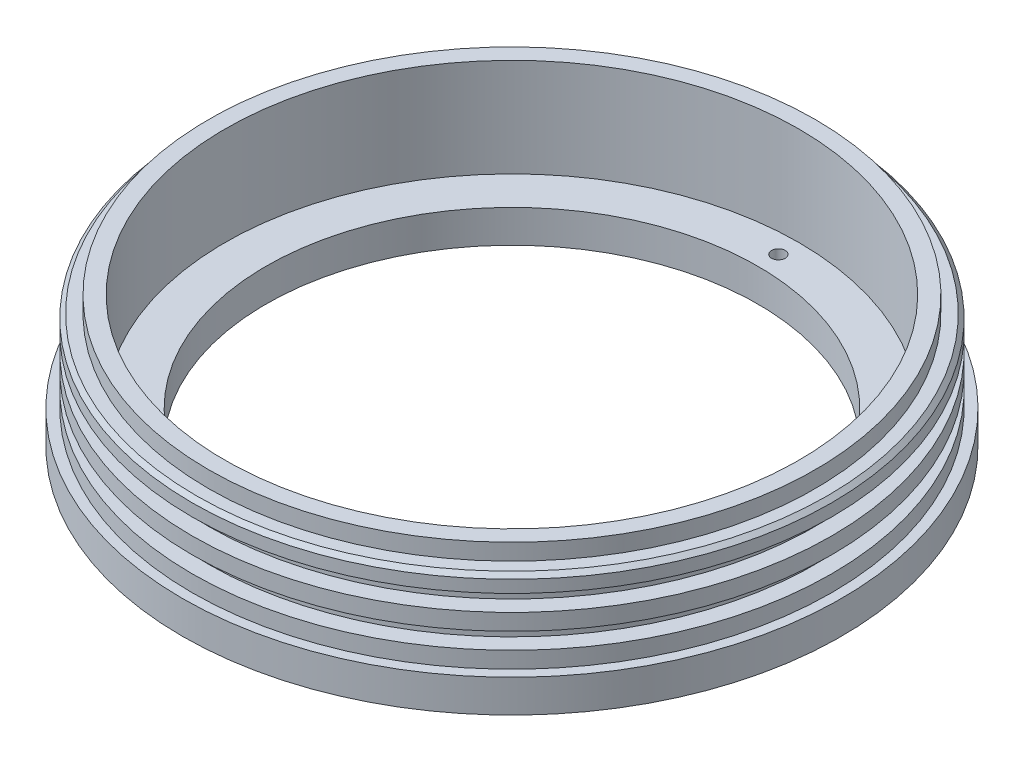
ISO-10303-21;
HEADER;
FILE_DESCRIPTION(('STEP AP214'),'2;1');
FILE_NAME('part.step','',(''),(''),'','','');
FILE_SCHEMA(('AUTOMOTIVE_DESIGN { 1 0 10303 214 1 1 1 1 }'));
ENDSEC;
DATA;
#1=APPLICATION_CONTEXT('core data for automotive mechanical design processes');
#2=APPLICATION_PROTOCOL_DEFINITION('international standard','automotive_design',2000,#1);
#3=PRODUCT_CONTEXT('',#1,'mechanical');
#4=PRODUCT('Part','Part','',(#3));
#5=PRODUCT_RELATED_PRODUCT_CATEGORY('part','',(#4));
#6=PRODUCT_DEFINITION_FORMATION('','',#4);
#7=PRODUCT_DEFINITION_CONTEXT('part definition',#1,'design');
#8=PRODUCT_DEFINITION('design','',#6,#7);
#9=PRODUCT_DEFINITION_SHAPE('','',#8);
#10=(LENGTH_UNIT() NAMED_UNIT(*) SI_UNIT(.MILLI.,.METRE.));
#11=(NAMED_UNIT(*) PLANE_ANGLE_UNIT() SI_UNIT($,.RADIAN.));
#12=(NAMED_UNIT(*) SI_UNIT($,.STERADIAN.) SOLID_ANGLE_UNIT());
#13=UNCERTAINTY_MEASURE_WITH_UNIT(LENGTH_MEASURE(1.E-05),#10,'distance_accuracy_value','');
#14=(GEOMETRIC_REPRESENTATION_CONTEXT(3) GLOBAL_UNCERTAINTY_ASSIGNED_CONTEXT((#13)) GLOBAL_UNIT_ASSIGNED_CONTEXT((#10,
#11,#12)) REPRESENTATION_CONTEXT('',''));
#15=CARTESIAN_POINT('',(0.,0.,0.));
#16=DIRECTION('',(0.,0.,1.));
#17=DIRECTION('',(1.,0.,0.));
#18=AXIS2_PLACEMENT_3D('',#15,#16,#17);
#19=CARTESIAN_POINT('',(0.,20.32,0.));
#20=DIRECTION('',(0.,1.,0.));
#21=DIRECTION('',(0.,0.,1.));
#22=AXIS2_PLACEMENT_3D('',#19,#20,#21);
#23=PLANE('',#22);
#24=CARTESIAN_POINT('',(0.,20.32,0.));
#25=DIRECTION('',(0.,1.,0.));
#26=DIRECTION('',(0.,0.,1.));
#27=AXIS2_PLACEMENT_3D('',#24,#25,#26);
#28=CIRCLE('',#27,44.45);
#29=CARTESIAN_POINT('',(0.,20.32,-44.45));
#30=VERTEX_POINT('',#29);
#31=EDGE_CURVE('E77',#30,#30,#28,.T.);
#32=ORIENTED_EDGE('',*,*,#31,.F.);
#33=EDGE_LOOP('',(#32));
#34=FACE_BOUND('',#33,.T.);
#35=CARTESIAN_POINT('',(0.,20.32,0.));
#36=DIRECTION('',(0.,-1.,0.));
#37=DIRECTION('',(0.,0.,-1.));
#38=AXIS2_PLACEMENT_3D('',#35,#36,#37);
#39=CIRCLE('',#38,46.99);
#40=CARTESIAN_POINT('',(0.,20.32,-46.99));
#41=VERTEX_POINT('',#40);
#42=EDGE_CURVE('E97',#41,#41,#39,.T.);
#43=ORIENTED_EDGE('',*,*,#42,.F.);
#44=EDGE_LOOP('',(#43));
#45=FACE_BOUND('',#44,.T.);
#46=ADVANCED_FACE('F46',(#34,#45),#23,.T.);
#47=CARTESIAN_POINT('',(0.,20.32,0.));
#48=DIRECTION('',(0.,-1.,0.));
#49=DIRECTION('',(0.,0.,-1.));
#50=AXIS2_PLACEMENT_3D('',#47,#48,#49);
#51=CYLINDRICAL_SURFACE('',#50,49.53);
#52=CARTESIAN_POINT('',(0.,5.08,0.));
#53=DIRECTION('',(0.,1.,0.));
#54=DIRECTION('',(0.,0.,1.));
#55=AXIS2_PLACEMENT_3D('',#52,#53,#54);
#56=CIRCLE('',#55,49.53);
#57=CARTESIAN_POINT('',(0.,5.08,-49.53));
#58=VERTEX_POINT('',#57);
#59=EDGE_CURVE('E61',#58,#58,#56,.T.);
#60=CARTESIAN_POINT('',(0.,7.62000000000001,0.));
#61=DIRECTION('',(0.,-1.,0.));
#62=DIRECTION('',(0.,0.,-1.));
#63=AXIS2_PLACEMENT_3D('',#60,#61,#62);
#64=CIRCLE('',#63,49.53);
#65=CARTESIAN_POINT('',(0.,7.62000000000001,-49.53));
#66=VERTEX_POINT('',#65);
#67=EDGE_CURVE('E120',#66,#66,#64,.T.);
#68=CARTESIAN_POINT('',(0.,5.08,-49.53));
#69=CARTESIAN_POINT('',(0.,5.10645833333333,-49.53));
#70=CARTESIAN_POINT('',(0.,5.13291666666667,-49.53));
#71=CARTESIAN_POINT('',(0.,5.18583333333333,-49.53));
#72=CARTESIAN_POINT('',(0.,5.21229166666667,-49.53));
#73=CARTESIAN_POINT('',(0.,5.26520833333333,-49.53));
#74=CARTESIAN_POINT('',(0.,5.29166666666667,-49.53));
#75=CARTESIAN_POINT('',(0.,5.34458333333333,-49.53));
#76=CARTESIAN_POINT('',(0.,5.37104166666667,-49.53));
#77=CARTESIAN_POINT('',(0.,5.42395833333333,-49.53));
#78=CARTESIAN_POINT('',(0.,5.45041666666667,-49.53));
#79=CARTESIAN_POINT('',(0.,5.50333333333333,-49.53));
#80=CARTESIAN_POINT('',(0.,5.52979166666667,-49.53));
#81=CARTESIAN_POINT('',(0.,5.58270833333334,-49.53));
#82=CARTESIAN_POINT('',(0.,5.60916666666667,-49.53));
#83=CARTESIAN_POINT('',(0.,5.66208333333334,-49.53));
#84=CARTESIAN_POINT('',(0.,5.68854166666667,-49.53));
#85=CARTESIAN_POINT('',(0.,5.74145833333334,-49.53));
#86=CARTESIAN_POINT('',(0.,5.76791666666667,-49.53));
#87=CARTESIAN_POINT('',(0.,5.82083333333334,-49.53));
#88=CARTESIAN_POINT('',(0.,5.84729166666667,-49.53));
#89=CARTESIAN_POINT('',(0.,5.90020833333334,-49.53));
#90=CARTESIAN_POINT('',(0.,5.92666666666667,-49.53));
#91=CARTESIAN_POINT('',(0.,5.97958333333334,-49.53));
#92=CARTESIAN_POINT('',(0.,6.00604166666667,-49.53));
#93=CARTESIAN_POINT('',(0.,6.05895833333334,-49.53));
#94=CARTESIAN_POINT('',(0.,6.08541666666667,-49.53));
#95=CARTESIAN_POINT('',(0.,6.13833333333334,-49.53));
#96=CARTESIAN_POINT('',(0.,6.16479166666667,-49.53));
#97=CARTESIAN_POINT('',(0.,6.21770833333334,-49.53));
#98=CARTESIAN_POINT('',(0.,6.24416666666667,-49.53));
#99=CARTESIAN_POINT('',(0.,6.29708333333334,-49.53));
#100=CARTESIAN_POINT('',(0.,6.32354166666667,-49.53));
#101=CARTESIAN_POINT('',(0.,6.37645833333334,-49.53));
#102=CARTESIAN_POINT('',(0.,6.40291666666667,-49.53));
#103=CARTESIAN_POINT('',(0.,6.45583333333334,-49.53));
#104=CARTESIAN_POINT('',(0.,6.48229166666667,-49.53));
#105=CARTESIAN_POINT('',(0.,6.53520833333334,-49.53));
#106=CARTESIAN_POINT('',(0.,6.56166666666667,-49.53));
#107=CARTESIAN_POINT('',(0.,6.61458333333334,-49.53));
#108=CARTESIAN_POINT('',(0.,6.64104166666667,-49.53));
#109=CARTESIAN_POINT('',(0.,6.69395833333334,-49.53));
#110=CARTESIAN_POINT('',(0.,6.72041666666667,-49.53));
#111=CARTESIAN_POINT('',(0.,6.77333333333334,-49.53));
#112=CARTESIAN_POINT('',(0.,6.79979166666667,-49.53));
#113=CARTESIAN_POINT('',(0.,6.85270833333334,-49.53));
#114=CARTESIAN_POINT('',(0.,6.87916666666667,-49.53));
#115=CARTESIAN_POINT('',(0.,6.93208333333334,-49.53));
#116=CARTESIAN_POINT('',(0.,6.95854166666667,-49.53));
#117=CARTESIAN_POINT('',(0.,7.01145833333334,-49.53));
#118=CARTESIAN_POINT('',(0.,7.03791666666667,-49.53));
#119=CARTESIAN_POINT('',(0.,7.09083333333334,-49.53));
#120=CARTESIAN_POINT('',(0.,7.11729166666668,-49.53));
#121=CARTESIAN_POINT('',(0.,7.17020833333334,-49.53));
#122=CARTESIAN_POINT('',(0.,7.19666666666668,-49.53));
#123=CARTESIAN_POINT('',(0.,7.24958333333334,-49.53));
#124=CARTESIAN_POINT('',(0.,7.27604166666668,-49.53));
#125=CARTESIAN_POINT('',(0.,7.32895833333334,-49.53));
#126=CARTESIAN_POINT('',(0.,7.35541666666668,-49.53));
#127=CARTESIAN_POINT('',(0.,7.40833333333334,-49.53));
#128=CARTESIAN_POINT('',(0.,7.43479166666668,-49.53));
#129=CARTESIAN_POINT('',(0.,7.48770833333334,-49.53));
#130=CARTESIAN_POINT('',(0.,7.51416666666668,-49.53));
#131=CARTESIAN_POINT('',(0.,7.56708333333334,-49.53));
#132=CARTESIAN_POINT('',(0.,7.59354166666668,-49.53));
#133=CARTESIAN_POINT('',(0.,7.62000000000001,-49.53));
#134=B_SPLINE_CURVE_WITH_KNOTS('',3,(#68,#69,#70,#71,#72,#73,#74,#75,#76,#77,#78,#79,#80,#81,
#82,#83,#84,#85,#86,#87,#88,#89,#90,#91,#92,#93,#94,#95,#96,#97,#98,#99,#100,#101,#102,#103,
#104,#105,#106,#107,#108,#109,#110,#111,#112,#113,#114,#115,#116,#117,#118,#119,#120,#121,#122,
#123,#124,#125,#126,#127,#128,#129,#130,#131,#132,#133),.UNSPECIFIED.,.F.,.F.,(4,2,2,2,2,2,2,2,
2,2,2,2,2,2,2,2,2,2,2,2,2,2,2,2,2,2,2,2,2,2,2,2,4),(0.,0.0793749999999996,0.158750000000001,
0.238125,0.317500000000002,0.396875000000001,0.476250000000003,0.555625000000002,
0.635000000000004,0.714375000000003,0.793750000000003,0.873125000000004,0.952500000000004,
1.031875,1.11125,1.190625,1.27000000000001,1.34937500000001,1.42875000000001,1.50812500000001,
1.58750000000001,1.66687500000001,1.74625000000001,1.82562500000001,1.90500000000001,
1.98437500000001,2.06375000000001,2.14312500000001,2.22250000000001,2.30187500000001,
2.38125000000001,2.46062500000001,2.54000000000001),.UNSPECIFIED.);
#135=EDGE_CURVE('BSEAM154',#58,#66,#134,.T.);
#136=ORIENTED_EDGE('',*,*,#59,.T.);
#137=ORIENTED_EDGE('',*,*,#67,.T.);
#138=ORIENTED_EDGE('',*,*,#135,.T.);
#139=ORIENTED_EDGE('',*,*,#135,.F.);
#140=EDGE_LOOP('',(#136,#138,#137,#139));
#141=FACE_BOUND('',#140,.T.);
#142=ADVANCED_FACE('F154',(#141),#51,.T.);
#143=CARTESIAN_POINT('',(0.,5.08,0.));
#144=DIRECTION('',(0.,1.,0.));
#145=DIRECTION('',(0.,0.,1.));
#146=AXIS2_PLACEMENT_3D('',#143,#144,#145);
#147=PLANE('',#146);
#148=CARTESIAN_POINT('',(0.,5.08,-41.275));
#149=DIRECTION('',(0.,1.,0.));
#150=DIRECTION('',(0.,0.,1.));
#151=AXIS2_PLACEMENT_3D('',#148,#149,#150);
#152=CIRCLE('',#151,1.058333164);
#153=CARTESIAN_POINT('',(0.,5.08,-40.216666836));
#154=VERTEX_POINT('',#153);
#155=EDGE_CURVE('E131',#154,#154,#152,.T.);
#156=ORIENTED_EDGE('',*,*,#155,.F.);
#157=EDGE_LOOP('',(#156));
#158=FACE_BOUND('',#157,.T.);
#159=CARTESIAN_POINT('',(0.,5.08,0.));
#160=DIRECTION('',(0.,1.,0.));
#161=DIRECTION('',(0.,0.,1.));
#162=AXIS2_PLACEMENT_3D('',#159,#160,#161);
#163=CIRCLE('',#162,38.1);
#164=CARTESIAN_POINT('',(0.,5.08,38.1));
#165=VERTEX_POINT('',#164);
#166=EDGE_CURVE('E69',#165,#165,#163,.T.);
#167=ORIENTED_EDGE('',*,*,#166,.F.);
#168=EDGE_LOOP('',(#167));
#169=FACE_BOUND('',#168,.T.);
#170=CARTESIAN_POINT('',(0.,5.08,0.));
#171=DIRECTION('',(0.,1.,0.));
#172=DIRECTION('',(0.,0.,1.));
#173=AXIS2_PLACEMENT_3D('',#170,#171,#172);
#174=CIRCLE('',#173,44.45);
#175=CARTESIAN_POINT('',(0.,5.08,-44.45));
#176=VERTEX_POINT('',#175);
#177=EDGE_CURVE('E84',#176,#176,#174,.T.);
#178=ORIENTED_EDGE('',*,*,#177,.T.);
#179=EDGE_LOOP('',(#178));
#180=FACE_BOUND('',#179,.T.);
#181=ADVANCED_FACE('F161',(#158,#169,#180),#147,.T.);
#182=ORIENTED_EDGE('',*,*,#59,.F.);
#183=EDGE_LOOP('',(#182));
#184=FACE_BOUND('',#183,.T.);
#185=CARTESIAN_POINT('',(0.,5.08,0.));
#186=DIRECTION('',(0.,1.,0.));
#187=DIRECTION('',(0.,0.,1.));
#188=AXIS2_PLACEMENT_3D('',#185,#186,#187);
#189=CIRCLE('',#188,51.054);
#190=CARTESIAN_POINT('',(0.,5.08,51.054));
#191=VERTEX_POINT('',#190);
#192=EDGE_CURVE('E68',#191,#191,#189,.T.);
#193=ORIENTED_EDGE('',*,*,#192,.T.);
#194=EDGE_LOOP('',(#193));
#195=FACE_BOUND('',#194,.T.);
#196=ADVANCED_FACE('F180',(#184,#195),#147,.T.);
#197=CARTESIAN_POINT('',(0.,0.,0.));
#198=DIRECTION('',(0.,1.,0.));
#199=DIRECTION('',(0.,0.,1.));
#200=AXIS2_PLACEMENT_3D('',#197,#198,#199);
#201=PLANE('',#200);
#202=CARTESIAN_POINT('',(0.,0.,-41.275));
#203=DIRECTION('',(0.,1.,0.));
#204=DIRECTION('',(0.,0.,1.));
#205=AXIS2_PLACEMENT_3D('',#202,#203,#204);
#206=CIRCLE('',#205,1.058333164);
#207=CARTESIAN_POINT('',(0.,0.,-40.216666836));
#208=VERTEX_POINT('',#207);
#209=EDGE_CURVE('E51',#208,#208,#206,.T.);
#210=ORIENTED_EDGE('',*,*,#209,.T.);
#211=EDGE_LOOP('',(#210));
#212=FACE_BOUND('',#211,.T.);
#213=CARTESIAN_POINT('',(0.,0.,0.));
#214=DIRECTION('',(0.,1.,0.));
#215=DIRECTION('',(0.,0.,1.));
#216=AXIS2_PLACEMENT_3D('',#213,#214,#215);
#217=CIRCLE('',#216,51.054);
#218=CARTESIAN_POINT('',(0.,0.,51.054));
#219=VERTEX_POINT('',#218);
#220=EDGE_CURVE('E64',#219,#219,#217,.T.);
#221=ORIENTED_EDGE('',*,*,#220,.F.);
#222=EDGE_LOOP('',(#221));
#223=FACE_BOUND('',#222,.T.);
#224=CARTESIAN_POINT('',(0.,0.,0.));
#225=DIRECTION('',(0.,1.,0.));
#226=DIRECTION('',(0.,0.,1.));
#227=AXIS2_PLACEMENT_3D('',#224,#225,#226);
#228=CIRCLE('',#227,38.1);
#229=CARTESIAN_POINT('',(0.,0.,38.1));
#230=VERTEX_POINT('',#229);
#231=EDGE_CURVE('E73',#230,#230,#228,.T.);
#232=ORIENTED_EDGE('',*,*,#231,.T.);
#233=EDGE_LOOP('',(#232));
#234=FACE_BOUND('',#233,.T.);
#235=ADVANCED_FACE('F140',(#212,#223,#234),#201,.F.);
#236=CARTESIAN_POINT('',(0.,5.08,0.));
#237=DIRECTION('',(0.,-1.,0.));
#238=DIRECTION('',(0.,0.,-1.));
#239=AXIS2_PLACEMENT_3D('',#236,#237,#238);
#240=CYLINDRICAL_SURFACE('',#239,51.054);
#241=ORIENTED_EDGE('',*,*,#192,.F.);
#242=EDGE_LOOP('',(#241));
#243=FACE_BOUND('',#242,.T.);
#244=ORIENTED_EDGE('',*,*,#220,.T.);
#245=EDGE_LOOP('',(#244));
#246=FACE_BOUND('',#245,.T.);
#247=ADVANCED_FACE('F178',(#243,#246),#240,.T.);
#248=CARTESIAN_POINT('',(0.,5.08,0.));
#249=DIRECTION('',(0.,-1.,0.));
#250=DIRECTION('',(0.,0.,-1.));
#251=AXIS2_PLACEMENT_3D('',#248,#249,#250);
#252=CYLINDRICAL_SURFACE('',#251,38.1);
#253=ORIENTED_EDGE('',*,*,#166,.T.);
#254=EDGE_LOOP('',(#253));
#255=FACE_BOUND('',#254,.T.);
#256=ORIENTED_EDGE('',*,*,#231,.F.);
#257=EDGE_LOOP('',(#256));
#258=FACE_BOUND('',#257,.T.);
#259=ADVANCED_FACE('F175',(#255,#258),#252,.F.);
#260=CARTESIAN_POINT('',(0.,20.32,0.));
#261=DIRECTION('',(0.,-1.,0.));
#262=DIRECTION('',(0.,0.,-1.));
#263=AXIS2_PLACEMENT_3D('',#260,#261,#262);
#264=CYLINDRICAL_SURFACE('',#263,44.45);
#265=CARTESIAN_POINT('',(0.,20.32,-44.45));
#266=CARTESIAN_POINT('',(0.,20.16125,-44.45));
#267=CARTESIAN_POINT('',(0.,20.0025,-44.45));
#268=CARTESIAN_POINT('',(0.,19.685,-44.45));
#269=CARTESIAN_POINT('',(0.,19.52625,-44.45));
#270=CARTESIAN_POINT('',(0.,19.20875,-44.45));
#271=CARTESIAN_POINT('',(0.,19.05,-44.45));
#272=CARTESIAN_POINT('',(0.,18.7325,-44.45));
#273=CARTESIAN_POINT('',(0.,18.57375,-44.45));
#274=CARTESIAN_POINT('',(0.,18.25625,-44.45));
#275=CARTESIAN_POINT('',(0.,18.0975,-44.45));
#276=CARTESIAN_POINT('',(0.,17.78,-44.45));
#277=CARTESIAN_POINT('',(0.,17.62125,-44.45));
#278=CARTESIAN_POINT('',(0.,17.30375,-44.45));
#279=CARTESIAN_POINT('',(0.,17.145,-44.45));
#280=CARTESIAN_POINT('',(0.,16.8275,-44.45));
#281=CARTESIAN_POINT('',(0.,16.66875,-44.45));
#282=CARTESIAN_POINT('',(0.,16.35125,-44.45));
#283=CARTESIAN_POINT('',(0.,16.1925,-44.45));
#284=CARTESIAN_POINT('',(0.,15.875,-44.45));
#285=CARTESIAN_POINT('',(0.,15.71625,-44.45));
#286=CARTESIAN_POINT('',(0.,15.39875,-44.45));
#287=CARTESIAN_POINT('',(0.,15.24,-44.45));
#288=CARTESIAN_POINT('',(0.,14.9225,-44.45));
#289=CARTESIAN_POINT('',(0.,14.76375,-44.45));
#290=CARTESIAN_POINT('',(0.,14.44625,-44.45));
#291=CARTESIAN_POINT('',(0.,14.2875,-44.45));
#292=CARTESIAN_POINT('',(0.,13.97,-44.45));
#293=CARTESIAN_POINT('',(0.,13.81125,-44.45));
#294=CARTESIAN_POINT('',(0.,13.49375,-44.45));
#295=CARTESIAN_POINT('',(0.,13.335,-44.45));
#296=CARTESIAN_POINT('',(0.,13.0175,-44.45));
#297=CARTESIAN_POINT('',(0.,12.85875,-44.45));
#298=CARTESIAN_POINT('',(0.,12.54125,-44.45));
#299=CARTESIAN_POINT('',(0.,12.3825,-44.45));
#300=CARTESIAN_POINT('',(0.,12.065,-44.45));
#301=CARTESIAN_POINT('',(0.,11.90625,-44.45));
#302=CARTESIAN_POINT('',(0.,11.58875,-44.45));
#303=CARTESIAN_POINT('',(0.,11.43,-44.45));
#304=CARTESIAN_POINT('',(0.,11.1125,-44.45));
#305=CARTESIAN_POINT('',(0.,10.95375,-44.45));
#306=CARTESIAN_POINT('',(0.,10.63625,-44.45));
#307=CARTESIAN_POINT('',(0.,10.4775,-44.45));
#308=CARTESIAN_POINT('',(0.,10.16,-44.45));
#309=CARTESIAN_POINT('',(0.,10.00125,-44.45));
#310=CARTESIAN_POINT('',(0.,9.68375,-44.45));
#311=CARTESIAN_POINT('',(0.,9.525,-44.45));
#312=CARTESIAN_POINT('',(0.,9.2075,-44.45));
#313=CARTESIAN_POINT('',(0.,9.04875,-44.45));
#314=CARTESIAN_POINT('',(0.,8.73125,-44.45));
#315=CARTESIAN_POINT('',(0.,8.5725,-44.45));
#316=CARTESIAN_POINT('',(0.,8.255,-44.45));
#317=CARTESIAN_POINT('',(0.,8.09625,-44.45));
#318=CARTESIAN_POINT('',(0.,7.77875,-44.45));
#319=CARTESIAN_POINT('',(0.,7.62,-44.45));
#320=CARTESIAN_POINT('',(0.,7.3025,-44.45));
#321=CARTESIAN_POINT('',(0.,7.14375,-44.45));
#322=CARTESIAN_POINT('',(0.,6.82625,-44.45));
#323=CARTESIAN_POINT('',(0.,6.6675,-44.45));
#324=CARTESIAN_POINT('',(0.,6.35,-44.45));
#325=CARTESIAN_POINT('',(0.,6.19125,-44.45));
#326=CARTESIAN_POINT('',(0.,5.87375,-44.45));
#327=CARTESIAN_POINT('',(0.,5.715,-44.45));
#328=CARTESIAN_POINT('',(0.,5.3975,-44.45));
#329=CARTESIAN_POINT('',(0.,5.23875,-44.45));
#330=CARTESIAN_POINT('',(0.,5.08,-44.45));
#331=B_SPLINE_CURVE_WITH_KNOTS('',3,(#265,#266,#267,#268,#269,#270,#271,#272,#273,#274,#275,
#276,#277,#278,#279,#280,#281,#282,#283,#284,#285,#286,#287,#288,#289,#290,#291,#292,#293,#294,
#295,#296,#297,#298,#299,#300,#301,#302,#303,#304,#305,#306,#307,#308,#309,#310,#311,#312,#313,
#314,#315,#316,#317,#318,#319,#320,#321,#322,#323,#324,#325,#326,#327,#328,#329,#330),
.UNSPECIFIED.,.F.,.F.,(4,2,2,2,2,2,2,2,2,2,2,2,2,2,2,2,2,2,2,2,2,2,2,2,2,2,2,2,2,2,2,2,4),(0.,
0.476249999999998,0.952499999999998,1.42875,1.905,2.38125,2.8575,3.33375,3.81,4.28624999999999,
4.7625,5.23875,5.715,6.19125,6.6675,7.14375,7.62,8.09625,8.57249999999999,9.04875,9.525,
10.00125,10.4775,10.95375,11.43,11.90625,12.3825,12.85875,13.335,13.81125,14.2875,14.76375,
15.24),.UNSPECIFIED.);
#332=EDGE_CURVE('BSEAM169',#30,#176,#331,.T.);
#333=ORIENTED_EDGE('',*,*,#31,.T.);
#334=ORIENTED_EDGE('',*,*,#177,.F.);
#335=ORIENTED_EDGE('',*,*,#332,.T.);
#336=ORIENTED_EDGE('',*,*,#332,.F.);
#337=EDGE_LOOP('',(#333,#335,#334,#336));
#338=FACE_BOUND('',#337,.T.);
#339=ADVANCED_FACE('F169',(#338),#264,.F.);
#340=CARTESIAN_POINT('',(0.,17.78,0.));
#341=DIRECTION('',(0.,1.,0.));
#342=DIRECTION('',(0.,0.,1.));
#343=AXIS2_PLACEMENT_3D('',#340,#341,#342);
#344=PLANE('',#343);
#345=CARTESIAN_POINT('',(0.,17.78,0.));
#346=DIRECTION('',(0.,1.,0.));
#347=DIRECTION('',(0.,0.,1.));
#348=AXIS2_PLACEMENT_3D('',#345,#346,#347);
#349=CIRCLE('',#348,48.8949999999999);
#350=CARTESIAN_POINT('',(0.,17.78,48.8949999999999));
#351=VERTEX_POINT('',#350);
#352=EDGE_CURVE('E10',#351,#351,#349,.T.);
#353=ORIENTED_EDGE('',*,*,#352,.T.);
#354=EDGE_LOOP('',(#353));
#355=FACE_BOUND('',#354,.T.);
#356=CARTESIAN_POINT('',(0.,17.78,0.));
#357=DIRECTION('',(0.,-1.,0.));
#358=DIRECTION('',(0.,0.,-1.));
#359=AXIS2_PLACEMENT_3D('',#356,#357,#358);
#360=CIRCLE('',#359,46.99);
#361=CARTESIAN_POINT('',(0.,17.78,-46.99));
#362=VERTEX_POINT('',#361);
#363=EDGE_CURVE('E92',#362,#362,#360,.T.);
#364=ORIENTED_EDGE('',*,*,#363,.T.);
#365=EDGE_LOOP('',(#364));
#366=FACE_BOUND('',#365,.T.);
#367=ADVANCED_FACE('F212',(#355,#366),#344,.T.);
#368=CARTESIAN_POINT('',(0.,0.,0.));
#369=DIRECTION('',(0.,-1.,0.));
#370=DIRECTION('',(0.,0.,-1.));
#371=AXIS2_PLACEMENT_3D('',#368,#369,#370);
#372=CYLINDRICAL_SURFACE('',#371,46.99);
#373=ORIENTED_EDGE('',*,*,#42,.T.);
#374=EDGE_LOOP('',(#373));
#375=FACE_BOUND('',#374,.T.);
#376=ORIENTED_EDGE('',*,*,#363,.F.);
#377=EDGE_LOOP('',(#376));
#378=FACE_BOUND('',#377,.T.);
#379=ADVANCED_FACE('F250',(#375,#378),#372,.T.);
#380=CARTESIAN_POINT('',(0.,10.16,0.));
#381=DIRECTION('',(0.,-1.,0.));
#382=DIRECTION('',(0.,0.,-1.));
#383=AXIS2_PLACEMENT_3D('',#380,#381,#382);
#384=PLANE('',#383);
#385=CARTESIAN_POINT('',(0.,10.16,0.));
#386=DIRECTION('',(0.,-1.,0.));
#387=DIRECTION('',(0.,0.,-1.));
#388=AXIS2_PLACEMENT_3D('',#385,#386,#387);
#389=CIRCLE('',#388,49.53);
#390=CARTESIAN_POINT('',(0.,10.16,-49.53));
#391=VERTEX_POINT('',#390);
#392=EDGE_CURVE('E88',#391,#391,#389,.T.);
#393=ORIENTED_EDGE('',*,*,#392,.T.);
#394=EDGE_LOOP('',(#393));
#395=FACE_BOUND('',#394,.T.);
#396=CARTESIAN_POINT('',(0.,10.16,0.));
#397=DIRECTION('',(0.,-1.,0.));
#398=DIRECTION('',(0.,0.,-1.));
#399=AXIS2_PLACEMENT_3D('',#396,#397,#398);
#400=CIRCLE('',#399,46.99);
#401=CARTESIAN_POINT('',(0.,10.16,-46.99));
#402=VERTEX_POINT('',#401);
#403=EDGE_CURVE('E105',#402,#402,#400,.T.);
#404=ORIENTED_EDGE('',*,*,#403,.F.);
#405=EDGE_LOOP('',(#404));
#406=FACE_BOUND('',#405,.T.);
#407=ADVANCED_FACE('F259',(#395,#406),#384,.T.);
#408=CARTESIAN_POINT('',(0.,7.62000000000001,0.));
#409=DIRECTION('',(0.,1.,0.));
#410=DIRECTION('',(0.,0.,1.));
#411=AXIS2_PLACEMENT_3D('',#408,#409,#410);
#412=PLANE('',#411);
#413=CARTESIAN_POINT('',(0.,7.62000000000001,0.));
#414=DIRECTION('',(0.,-1.,0.));
#415=DIRECTION('',(0.,0.,-1.));
#416=AXIS2_PLACEMENT_3D('',#413,#414,#415);
#417=CIRCLE('',#416,46.99);
#418=CARTESIAN_POINT('',(0.,7.62000000000001,-46.99));
#419=VERTEX_POINT('',#418);
#420=EDGE_CURVE('E124',#419,#419,#417,.T.);
#421=ORIENTED_EDGE('',*,*,#420,.T.);
#422=EDGE_LOOP('',(#421));
#423=FACE_BOUND('',#422,.T.);
#424=ORIENTED_EDGE('',*,*,#67,.F.);
#425=EDGE_LOOP('',(#424));
#426=FACE_BOUND('',#425,.T.);
#427=ADVANCED_FACE('F269',(#423,#426),#412,.T.);
#428=CARTESIAN_POINT('',(0.,0.,0.));
#429=DIRECTION('',(0.,-1.,0.));
#430=DIRECTION('',(0.,0.,-1.));
#431=AXIS2_PLACEMENT_3D('',#428,#429,#430);
#432=CYLINDRICAL_SURFACE('',#431,46.99);
#433=ORIENTED_EDGE('',*,*,#403,.T.);
#434=EDGE_LOOP('',(#433));
#435=FACE_BOUND('',#434,.T.);
#436=ORIENTED_EDGE('',*,*,#420,.F.);
#437=EDGE_LOOP('',(#436));
#438=FACE_BOUND('',#437,.T.);
#439=ADVANCED_FACE('F227',(#435,#438),#432,.T.);
#440=CARTESIAN_POINT('',(0.,17.1449999999999,0.));
#441=DIRECTION('',(0.,1.,0.));
#442=DIRECTION('',(0.,0.,1.));
#443=AXIS2_PLACEMENT_3D('',#440,#441,#442);
#444=CIRCLE('',#443,49.53);
#445=CARTESIAN_POINT('',(0.,17.1449999999999,-49.53));
#446=VERTEX_POINT('',#445);
#447=EDGE_CURVE('E56',#446,#446,#444,.F.);
#448=CARTESIAN_POINT('',(0.,15.24,0.));
#449=DIRECTION('',(0.,-1.,0.));
#450=DIRECTION('',(0.,0.,-1.));
#451=AXIS2_PLACEMENT_3D('',#448,#449,#450);
#452=CIRCLE('',#451,49.53);
#453=CARTESIAN_POINT('',(0.,15.24,-49.53));
#454=VERTEX_POINT('',#453);
#455=EDGE_CURVE('E101',#454,#454,#452,.T.);
#456=CARTESIAN_POINT('',(0.,17.1449999999999,-49.53));
#457=CARTESIAN_POINT('',(0.,17.1251562499999,-49.53));
#458=CARTESIAN_POINT('',(0.,17.1053124999999,-49.53));
#459=CARTESIAN_POINT('',(0.,17.0656249999999,-49.53));
#460=CARTESIAN_POINT('',(0.,17.0457812499999,-49.53));
#461=CARTESIAN_POINT('',(0.,17.0060937499999,-49.53));
#462=CARTESIAN_POINT('',(0.,16.9862499999999,-49.53));
#463=CARTESIAN_POINT('',(0.,16.9465624999999,-49.53));
#464=CARTESIAN_POINT('',(0.,16.9267187499999,-49.53));
#465=CARTESIAN_POINT('',(0.,16.8870312499999,-49.53));
#466=CARTESIAN_POINT('',(0.,16.8671875,-49.53));
#467=CARTESIAN_POINT('',(0.,16.8275,-49.53));
#468=CARTESIAN_POINT('',(0.,16.80765625,-49.53));
#469=CARTESIAN_POINT('',(0.,16.76796875,-49.53));
#470=CARTESIAN_POINT('',(0.,16.748125,-49.53));
#471=CARTESIAN_POINT('',(0.,16.7084375,-49.53));
#472=CARTESIAN_POINT('',(0.,16.68859375,-49.53));
#473=CARTESIAN_POINT('',(0.,16.64890625,-49.53));
#474=CARTESIAN_POINT('',(0.,16.6290625,-49.53));
#475=CARTESIAN_POINT('',(0.,16.589375,-49.53));
#476=CARTESIAN_POINT('',(0.,16.56953125,-49.53));
#477=CARTESIAN_POINT('',(0.,16.52984375,-49.53));
#478=CARTESIAN_POINT('',(0.,16.51,-49.53));
#479=CARTESIAN_POINT('',(0.,16.4703125,-49.53));
#480=CARTESIAN_POINT('',(0.,16.45046875,-49.53));
#481=CARTESIAN_POINT('',(0.,16.41078125,-49.53));
#482=CARTESIAN_POINT('',(0.,16.3909375,-49.53));
#483=CARTESIAN_POINT('',(0.,16.35125,-49.53));
#484=CARTESIAN_POINT('',(0.,16.33140625,-49.53));
#485=CARTESIAN_POINT('',(0.,16.29171875,-49.53));
#486=CARTESIAN_POINT('',(0.,16.271875,-49.53));
#487=CARTESIAN_POINT('',(0.,16.2321875,-49.53));
#488=CARTESIAN_POINT('',(0.,16.21234375,-49.53));
#489=CARTESIAN_POINT('',(0.,16.17265625,-49.53));
#490=CARTESIAN_POINT('',(0.,16.1528125,-49.53));
#491=CARTESIAN_POINT('',(0.,16.113125,-49.53));
#492=CARTESIAN_POINT('',(0.,16.09328125,-49.53));
#493=CARTESIAN_POINT('',(0.,16.05359375,-49.53));
#494=CARTESIAN_POINT('',(0.,16.03375,-49.53));
#495=CARTESIAN_POINT('',(0.,15.9940625,-49.53));
#496=CARTESIAN_POINT('',(0.,15.97421875,-49.53));
#497=CARTESIAN_POINT('',(0.,15.93453125,-49.53));
#498=CARTESIAN_POINT('',(0.,15.9146875,-49.53));
#499=CARTESIAN_POINT('',(0.,15.875,-49.53));
#500=CARTESIAN_POINT('',(0.,15.85515625,-49.53));
#501=CARTESIAN_POINT('',(0.,15.81546875,-49.53));
#502=CARTESIAN_POINT('',(0.,15.795625,-49.53));
#503=CARTESIAN_POINT('',(0.,15.7559375,-49.53));
#504=CARTESIAN_POINT('',(0.,15.73609375,-49.53));
#505=CARTESIAN_POINT('',(0.,15.69640625,-49.53));
#506=CARTESIAN_POINT('',(0.,15.6765625,-49.53));
#507=CARTESIAN_POINT('',(0.,15.636875,-49.53));
#508=CARTESIAN_POINT('',(0.,15.61703125,-49.53));
#509=CARTESIAN_POINT('',(0.,15.57734375,-49.53));
#510=CARTESIAN_POINT('',(0.,15.5575,-49.53));
#511=CARTESIAN_POINT('',(0.,15.5178125,-49.53));
#512=CARTESIAN_POINT('',(0.,15.49796875,-49.53));
#513=CARTESIAN_POINT('',(0.,15.45828125,-49.53));
#514=CARTESIAN_POINT('',(0.,15.4384375,-49.53));
#515=CARTESIAN_POINT('',(0.,15.39875,-49.53));
#516=CARTESIAN_POINT('',(0.,15.37890625,-49.53));
#517=CARTESIAN_POINT('',(0.,15.33921875,-49.53));
#518=CARTESIAN_POINT('',(0.,15.319375,-49.53));
#519=CARTESIAN_POINT('',(0.,15.2796875,-49.53));
#520=CARTESIAN_POINT('',(0.,15.25984375,-49.53));
#521=CARTESIAN_POINT('',(0.,15.24,-49.53));
#522=B_SPLINE_CURVE_WITH_KNOTS('',3,(#456,#457,#458,#459,#460,#461,#462,#463,#464,#465,#466,
#467,#468,#469,#470,#471,#472,#473,#474,#475,#476,#477,#478,#479,#480,#481,#482,#483,#484,#485,
#486,#487,#488,#489,#490,#491,#492,#493,#494,#495,#496,#497,#498,#499,#500,#501,#502,#503,#504,
#505,#506,#507,#508,#509,#510,#511,#512,#513,#514,#515,#516,#517,#518,#519,#520,#521),
.UNSPECIFIED.,.F.,.F.,(4,2,2,2,2,2,2,2,2,2,2,2,2,2,2,2,2,2,2,2,2,2,2,2,2,2,2,2,2,2,2,2,4),(0.,
0.059531249999998,0.119062499999996,0.178593749999994,0.238124999999992,0.29765624999999,
0.357187499999988,0.416718749999986,0.476249999999984,0.535781249999982,0.595312499999979,
0.654843749999978,0.714374999999972,0.773906249999973,0.833437499999968,0.892968749999966,
0.952499999999964,1.01203124999996,1.07156249999996,1.13109374999996,1.19062499999996,
1.25015624999995,1.30968749999995,1.36921874999995,1.42874999999995,1.48828124999995,
1.54781249999994,1.60734374999994,1.66687499999994,1.72640624999994,1.78593749999994,
1.84546874999993,1.90499999999993),.UNSPECIFIED.);
#523=EDGE_CURVE('BSEAM164',#446,#454,#522,.T.);
#524=ORIENTED_EDGE('',*,*,#447,.T.);
#525=ORIENTED_EDGE('',*,*,#455,.F.);
#526=ORIENTED_EDGE('',*,*,#523,.T.);
#527=ORIENTED_EDGE('',*,*,#523,.F.);
#528=EDGE_LOOP('',(#524,#526,#525,#527));
#529=FACE_BOUND('',#528,.T.);
#530=ADVANCED_FACE('F164',(#529),#51,.T.);
#531=CARTESIAN_POINT('',(0.,12.7,0.));
#532=DIRECTION('',(0.,-1.,0.));
#533=DIRECTION('',(0.,0.,-1.));
#534=AXIS2_PLACEMENT_3D('',#531,#532,#533);
#535=CIRCLE('',#534,49.53);
#536=CARTESIAN_POINT('',(0.,12.7,-49.53));
#537=VERTEX_POINT('',#536);
#538=EDGE_CURVE('E106',#537,#537,#535,.T.);
#539=CARTESIAN_POINT('',(0.,12.7,-49.53));
#540=CARTESIAN_POINT('',(0.,12.6735416666667,-49.53));
#541=CARTESIAN_POINT('',(0.,12.6470833333333,-49.53));
#542=CARTESIAN_POINT('',(0.,12.5941666666667,-49.53));
#543=CARTESIAN_POINT('',(0.,12.5677083333333,-49.53));
#544=CARTESIAN_POINT('',(0.,12.5147916666667,-49.53));
#545=CARTESIAN_POINT('',(0.,12.4883333333333,-49.53));
#546=CARTESIAN_POINT('',(0.,12.4354166666667,-49.53));
#547=CARTESIAN_POINT('',(0.,12.4089583333333,-49.53));
#548=CARTESIAN_POINT('',(0.,12.3560416666667,-49.53));
#549=CARTESIAN_POINT('',(0.,12.3295833333333,-49.53));
#550=CARTESIAN_POINT('',(0.,12.2766666666667,-49.53));
#551=CARTESIAN_POINT('',(0.,12.2502083333333,-49.53));
#552=CARTESIAN_POINT('',(0.,12.1972916666667,-49.53));
#553=CARTESIAN_POINT('',(0.,12.1708333333333,-49.53));
#554=CARTESIAN_POINT('',(0.,12.1179166666667,-49.53));
#555=CARTESIAN_POINT('',(0.,12.0914583333333,-49.53));
#556=CARTESIAN_POINT('',(0.,12.0385416666667,-49.53));
#557=CARTESIAN_POINT('',(0.,12.0120833333333,-49.53));
#558=CARTESIAN_POINT('',(0.,11.9591666666667,-49.53));
#559=CARTESIAN_POINT('',(0.,11.9327083333333,-49.53));
#560=CARTESIAN_POINT('',(0.,11.8797916666667,-49.53));
#561=CARTESIAN_POINT('',(0.,11.8533333333333,-49.53));
#562=CARTESIAN_POINT('',(0.,11.8004166666667,-49.53));
#563=CARTESIAN_POINT('',(0.,11.7739583333333,-49.53));
#564=CARTESIAN_POINT('',(0.,11.7210416666667,-49.53));
#565=CARTESIAN_POINT('',(0.,11.6945833333333,-49.53));
#566=CARTESIAN_POINT('',(0.,11.6416666666667,-49.53));
#567=CARTESIAN_POINT('',(0.,11.6152083333333,-49.53));
#568=CARTESIAN_POINT('',(0.,11.5622916666667,-49.53));
#569=CARTESIAN_POINT('',(0.,11.5358333333333,-49.53));
#570=CARTESIAN_POINT('',(0.,11.4829166666667,-49.53));
#571=CARTESIAN_POINT('',(0.,11.4564583333333,-49.53));
#572=CARTESIAN_POINT('',(0.,11.4035416666667,-49.53));
#573=CARTESIAN_POINT('',(0.,11.3770833333333,-49.53));
#574=CARTESIAN_POINT('',(0.,11.3241666666667,-49.53));
#575=CARTESIAN_POINT('',(0.,11.2977083333333,-49.53));
#576=CARTESIAN_POINT('',(0.,11.2447916666667,-49.53));
#577=CARTESIAN_POINT('',(0.,11.2183333333333,-49.53));
#578=CARTESIAN_POINT('',(0.,11.1654166666667,-49.53));
#579=CARTESIAN_POINT('',(0.,11.1389583333333,-49.53));
#580=CARTESIAN_POINT('',(0.,11.0860416666667,-49.53));
#581=CARTESIAN_POINT('',(0.,11.0595833333333,-49.53));
#582=CARTESIAN_POINT('',(0.,11.0066666666667,-49.53));
#583=CARTESIAN_POINT('',(0.,10.9802083333333,-49.53));
#584=CARTESIAN_POINT('',(0.,10.9272916666667,-49.53));
#585=CARTESIAN_POINT('',(0.,10.9008333333333,-49.53));
#586=CARTESIAN_POINT('',(0.,10.8479166666667,-49.53));
#587=CARTESIAN_POINT('',(0.,10.8214583333333,-49.53));
#588=CARTESIAN_POINT('',(0.,10.7685416666667,-49.53));
#589=CARTESIAN_POINT('',(0.,10.7420833333333,-49.53));
#590=CARTESIAN_POINT('',(0.,10.6891666666667,-49.53));
#591=CARTESIAN_POINT('',(0.,10.6627083333333,-49.53));
#592=CARTESIAN_POINT('',(0.,10.6097916666667,-49.53));
#593=CARTESIAN_POINT('',(0.,10.5833333333333,-49.53));
#594=CARTESIAN_POINT('',(0.,10.5304166666667,-49.53));
#595=CARTESIAN_POINT('',(0.,10.5039583333333,-49.53));
#596=CARTESIAN_POINT('',(0.,10.4510416666667,-49.53));
#597=CARTESIAN_POINT('',(0.,10.4245833333333,-49.53));
#598=CARTESIAN_POINT('',(0.,10.3716666666667,-49.53));
#599=CARTESIAN_POINT('',(0.,10.3452083333333,-49.53));
#600=CARTESIAN_POINT('',(0.,10.2922916666667,-49.53));
#601=CARTESIAN_POINT('',(0.,10.2658333333333,-49.53));
#602=CARTESIAN_POINT('',(0.,10.2129166666667,-49.53));
#603=CARTESIAN_POINT('',(0.,10.1864583333333,-49.53));
#604=CARTESIAN_POINT('',(0.,10.16,-49.53));
#605=B_SPLINE_CURVE_WITH_KNOTS('',3,(#539,#540,#541,#542,#543,#544,#545,#546,#547,#548,#549,
#550,#551,#552,#553,#554,#555,#556,#557,#558,#559,#560,#561,#562,#563,#564,#565,#566,#567,#568,
#569,#570,#571,#572,#573,#574,#575,#576,#577,#578,#579,#580,#581,#582,#583,#584,#585,#586,#587,
#588,#589,#590,#591,#592,#593,#594,#595,#596,#597,#598,#599,#600,#601,#602,#603,#604),
.UNSPECIFIED.,.F.,.F.,(4,2,2,2,2,2,2,2,2,2,2,2,2,2,2,2,2,2,2,2,2,2,2,2,2,2,2,2,2,2,2,2,4),(0.,
0.0793749999999996,0.158749999999999,0.238124999999999,0.317499999999998,0.396874999999998,
0.476249999999999,0.555624999999999,0.634999999999998,0.714374999999998,0.793749999999998,
0.873124999999999,0.952499999999998,1.031875,1.11125,1.190625,1.27,1.349375,1.42875,1.508125,
1.5875,1.666875,1.74625,1.825625,1.905,1.984375,2.06375,2.143125,2.2225,2.301875,2.38125,
2.460625,2.54),.UNSPECIFIED.);
#606=EDGE_CURVE('BSEAM165',#537,#391,#605,.T.);
#607=ORIENTED_EDGE('',*,*,#538,.T.);
#608=ORIENTED_EDGE('',*,*,#392,.F.);
#609=ORIENTED_EDGE('',*,*,#606,.T.);
#610=ORIENTED_EDGE('',*,*,#606,.F.);
#611=EDGE_LOOP('',(#607,#609,#608,#610));
#612=FACE_BOUND('',#611,.T.);
#613=ADVANCED_FACE('F165',(#612),#51,.T.);
#614=CARTESIAN_POINT('',(0.,15.24,0.));
#615=DIRECTION('',(0.,-1.,0.));
#616=DIRECTION('',(0.,0.,-1.));
#617=AXIS2_PLACEMENT_3D('',#614,#615,#616);
#618=PLANE('',#617);
#619=ORIENTED_EDGE('',*,*,#455,.T.);
#620=EDGE_LOOP('',(#619));
#621=FACE_BOUND('',#620,.T.);
#622=CARTESIAN_POINT('',(0.,15.24,0.));
#623=DIRECTION('',(0.,-1.,0.));
#624=DIRECTION('',(0.,0.,-1.));
#625=AXIS2_PLACEMENT_3D('',#622,#623,#624);
#626=CIRCLE('',#625,46.99);
#627=CARTESIAN_POINT('',(0.,15.24,-46.99));
#628=VERTEX_POINT('',#627);
#629=EDGE_CURVE('E96',#628,#628,#626,.T.);
#630=ORIENTED_EDGE('',*,*,#629,.F.);
#631=EDGE_LOOP('',(#630));
#632=FACE_BOUND('',#631,.T.);
#633=ADVANCED_FACE('F173',(#621,#632),#618,.T.);
#634=CARTESIAN_POINT('',(0.,12.7,0.));
#635=DIRECTION('',(0.,1.,0.));
#636=DIRECTION('',(0.,0.,1.));
#637=AXIS2_PLACEMENT_3D('',#634,#635,#636);
#638=PLANE('',#637);
#639=CARTESIAN_POINT('',(0.,12.7,0.));
#640=DIRECTION('',(0.,-1.,0.));
#641=DIRECTION('',(0.,0.,-1.));
#642=AXIS2_PLACEMENT_3D('',#639,#640,#641);
#643=CIRCLE('',#642,46.99);
#644=CARTESIAN_POINT('',(0.,12.7,-46.99));
#645=VERTEX_POINT('',#644);
#646=EDGE_CURVE('E110',#645,#645,#643,.T.);
#647=ORIENTED_EDGE('',*,*,#646,.T.);
#648=EDGE_LOOP('',(#647));
#649=FACE_BOUND('',#648,.T.);
#650=ORIENTED_EDGE('',*,*,#538,.F.);
#651=EDGE_LOOP('',(#650));
#652=FACE_BOUND('',#651,.T.);
#653=ADVANCED_FACE('F296',(#649,#652),#638,.T.);
#654=CARTESIAN_POINT('',(0.,0.,0.));
#655=DIRECTION('',(0.,-1.,0.));
#656=DIRECTION('',(0.,0.,-1.));
#657=AXIS2_PLACEMENT_3D('',#654,#655,#656);
#658=CYLINDRICAL_SURFACE('',#657,46.99);
#659=ORIENTED_EDGE('',*,*,#629,.T.);
#660=EDGE_LOOP('',(#659));
#661=FACE_BOUND('',#660,.T.);
#662=ORIENTED_EDGE('',*,*,#646,.F.);
#663=EDGE_LOOP('',(#662));
#664=FACE_BOUND('',#663,.T.);
#665=ADVANCED_FACE('F150',(#661,#664),#658,.T.);
#666=CARTESIAN_POINT('',(0.,17.1449999999999,0.));
#667=DIRECTION('',(0.,-1.,0.));
#668=DIRECTION('',(0.,0.,-1.));
#669=AXIS2_PLACEMENT_3D('',#666,#667,#668);
#670=CONICAL_SURFACE('',#669,49.53,0.785398163397448);
#671=ORIENTED_EDGE('',*,*,#352,.F.);
#672=EDGE_LOOP('',(#671));
#673=FACE_BOUND('',#672,.T.);
#674=ORIENTED_EDGE('',*,*,#447,.F.);
#675=EDGE_LOOP('',(#674));
#676=FACE_BOUND('',#675,.T.);
#677=ADVANCED_FACE('F49',(#673,#676),#670,.T.);
#678=CARTESIAN_POINT('',(0.,-21.59,-41.275));
#679=DIRECTION('',(0.,1.,0.));
#680=DIRECTION('',(0.,0.,1.));
#681=AXIS2_PLACEMENT_3D('',#678,#679,#680);
#682=CYLINDRICAL_SURFACE('',#681,1.058333164);
#683=CARTESIAN_POINT('',(0.,5.08,-40.216666836));
#684=CARTESIAN_POINT('',(0.,5.02708333333333,-40.216666836));
#685=CARTESIAN_POINT('',(0.,4.97416666666667,-40.216666836));
#686=CARTESIAN_POINT('',(0.,4.86833333333334,-40.216666836));
#687=CARTESIAN_POINT('',(0.,4.81541666666667,-40.216666836));
#688=CARTESIAN_POINT('',(0.,4.70958333333334,-40.216666836));
#689=CARTESIAN_POINT('',(0.,4.65666666666667,-40.216666836));
#690=CARTESIAN_POINT('',(0.,4.55083333333333,-40.216666836));
#691=CARTESIAN_POINT('',(0.,4.49791666666667,-40.216666836));
#692=CARTESIAN_POINT('',(0.,4.39208333333333,-40.216666836));
#693=CARTESIAN_POINT('',(0.,4.33916666666667,-40.216666836));
#694=CARTESIAN_POINT('',(0.,4.23333333333333,-40.216666836));
#695=CARTESIAN_POINT('',(0.,4.18041666666667,-40.216666836));
#696=CARTESIAN_POINT('',(0.,4.07458333333333,-40.216666836));
#697=CARTESIAN_POINT('',(0.,4.02166666666667,-40.216666836));
#698=CARTESIAN_POINT('',(0.,3.91583333333333,-40.216666836));
#699=CARTESIAN_POINT('',(0.,3.86291666666667,-40.216666836));
#700=CARTESIAN_POINT('',(0.,3.75708333333333,-40.216666836));
#701=CARTESIAN_POINT('',(0.,3.70416666666667,-40.216666836));
#702=CARTESIAN_POINT('',(0.,3.59833333333334,-40.216666836));
#703=CARTESIAN_POINT('',(0.,3.54541666666667,-40.216666836));
#704=CARTESIAN_POINT('',(0.,3.43958333333333,-40.216666836));
#705=CARTESIAN_POINT('',(0.,3.38666666666667,-40.216666836));
#706=CARTESIAN_POINT('',(0.,3.28083333333333,-40.216666836));
#707=CARTESIAN_POINT('',(0.,3.22791666666667,-40.216666836));
#708=CARTESIAN_POINT('',(0.,3.12208333333333,-40.216666836));
#709=CARTESIAN_POINT('',(0.,3.06916666666667,-40.216666836));
#710=CARTESIAN_POINT('',(0.,2.96333333333333,-40.216666836));
#711=CARTESIAN_POINT('',(0.,2.91041666666667,-40.216666836));
#712=CARTESIAN_POINT('',(0.,2.80458333333333,-40.216666836));
#713=CARTESIAN_POINT('',(0.,2.75166666666667,-40.216666836));
#714=CARTESIAN_POINT('',(0.,2.64583333333333,-40.216666836));
#715=CARTESIAN_POINT('',(0.,2.59291666666667,-40.216666836));
#716=CARTESIAN_POINT('',(0.,2.48708333333333,-40.216666836));
#717=CARTESIAN_POINT('',(0.,2.43416666666667,-40.216666836));
#718=CARTESIAN_POINT('',(0.,2.32833333333333,-40.216666836));
#719=CARTESIAN_POINT('',(0.,2.27541666666667,-40.216666836));
#720=CARTESIAN_POINT('',(0.,2.16958333333333,-40.216666836));
#721=CARTESIAN_POINT('',(0.,2.11666666666667,-40.216666836));
#722=CARTESIAN_POINT('',(0.,2.01083333333333,-40.216666836));
#723=CARTESIAN_POINT('',(0.,1.95791666666667,-40.216666836));
#724=CARTESIAN_POINT('',(0.,1.85208333333333,-40.216666836));
#725=CARTESIAN_POINT('',(0.,1.79916666666667,-40.216666836));
#726=CARTESIAN_POINT('',(0.,1.69333333333333,-40.216666836));
#727=CARTESIAN_POINT('',(0.,1.64041666666667,-40.216666836));
#728=CARTESIAN_POINT('',(0.,1.53458333333333,-40.216666836));
#729=CARTESIAN_POINT('',(0.,1.48166666666667,-40.216666836));
#730=CARTESIAN_POINT('',(0.,1.37583333333333,-40.216666836));
#731=CARTESIAN_POINT('',(0.,1.32291666666667,-40.216666836));
#732=CARTESIAN_POINT('',(0.,1.21708333333333,-40.216666836));
#733=CARTESIAN_POINT('',(0.,1.16416666666667,-40.216666836));
#734=CARTESIAN_POINT('',(0.,1.05833333333333,-40.216666836));
#735=CARTESIAN_POINT('',(0.,1.00541666666667,-40.216666836));
#736=CARTESIAN_POINT('',(0.,0.899583333333334,-40.216666836));
#737=CARTESIAN_POINT('',(0.,0.846666666666667,-40.216666836));
#738=CARTESIAN_POINT('',(0.,0.740833333333333,-40.216666836));
#739=CARTESIAN_POINT('',(0.,0.687916666666667,-40.216666836));
#740=CARTESIAN_POINT('',(0.,0.582083333333334,-40.216666836));
#741=CARTESIAN_POINT('',(0.,0.529166666666667,-40.216666836));
#742=CARTESIAN_POINT('',(0.,0.423333333333333,-40.216666836));
#743=CARTESIAN_POINT('',(0.,0.370416666666666,-40.216666836));
#744=CARTESIAN_POINT('',(0.,0.264583333333332,-40.216666836));
#745=CARTESIAN_POINT('',(0.,0.211666666666666,-40.216666836));
#746=CARTESIAN_POINT('',(0.,0.105833333333333,-40.216666836));
#747=CARTESIAN_POINT('',(0.,0.0529166666666663,-40.216666836));
#748=CARTESIAN_POINT('',(0.,0.,-40.216666836));
#749=B_SPLINE_CURVE_WITH_KNOTS('',3,(#683,#684,#685,#686,#687,#688,#689,#690,#691,#692,#693,
#694,#695,#696,#697,#698,#699,#700,#701,#702,#703,#704,#705,#706,#707,#708,#709,#710,#711,#712,
#713,#714,#715,#716,#717,#718,#719,#720,#721,#722,#723,#724,#725,#726,#727,#728,#729,#730,#731,
#732,#733,#734,#735,#736,#737,#738,#739,#740,#741,#742,#743,#744,#745,#746,#747,#748),
.UNSPECIFIED.,.F.,.F.,(4,2,2,2,2,2,2,2,2,2,2,2,2,2,2,2,2,2,2,2,2,2,2,2,2,2,2,2,2,2,2,2,4),(0.,
0.158749999999999,0.317499999999998,0.476250000000001,0.635,0.793749999999999,0.952500000000002,
1.11125,1.27,1.42875,1.5875,1.74625,1.905,2.06375,2.2225,2.38125,2.54,2.69875,2.8575,3.01625,
3.175,3.33375,3.4925,3.65125,3.81,3.96875,4.1275,4.28625,4.445,4.60375,4.7625,4.92125,5.08),.UNSPECIFIED.);
#750=EDGE_CURVE('BSEAM143',#154,#208,#749,.T.);
#751=ORIENTED_EDGE('',*,*,#155,.T.);
#752=ORIENTED_EDGE('',*,*,#209,.F.);
#753=ORIENTED_EDGE('',*,*,#750,.T.);
#754=ORIENTED_EDGE('',*,*,#750,.F.);
#755=EDGE_LOOP('',(#751,#753,#752,#754));
#756=FACE_BOUND('',#755,.T.);
#757=ADVANCED_FACE('F143',(#756),#682,.F.);
#758=CLOSED_SHELL('',(#46,#142,#181,#196,#235,#247,#259,#339,#367,#379,#407,#427,#439,#530,#613,
#633,#653,#665,#677,#757));
#759=MANIFOLD_SOLID_BREP('B2',#758);
#760=ADVANCED_BREP_SHAPE_REPRESENTATION('',(#18,#759),#14);
#761=SHAPE_DEFINITION_REPRESENTATION(#9,#760);
ENDSEC;
END-ISO-10303-21;
